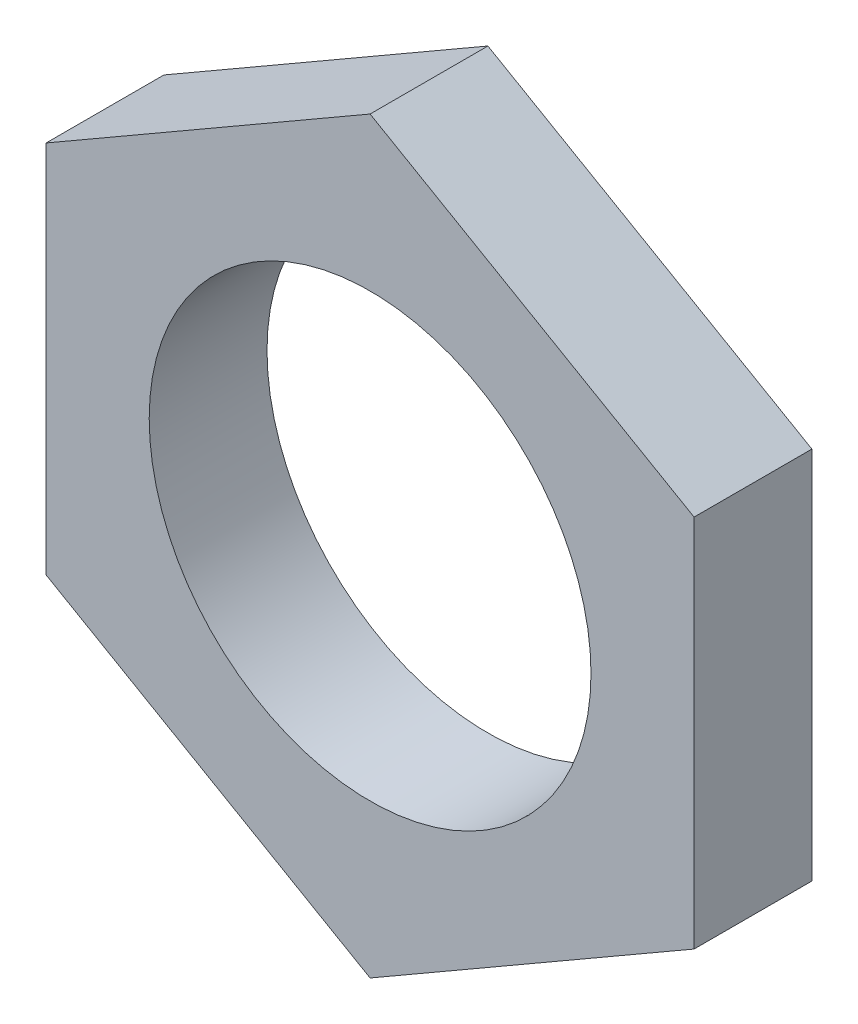
ISO-10303-21;
HEADER;
FILE_DESCRIPTION(('STEP AP214'),'2;1');
FILE_NAME('part.step','',(''),(''),'','','');
FILE_SCHEMA(('AUTOMOTIVE_DESIGN { 1 0 10303 214 1 1 1 1 }'));
ENDSEC;
DATA;
#1=APPLICATION_CONTEXT('core data for automotive mechanical design processes');
#2=APPLICATION_PROTOCOL_DEFINITION('international standard','automotive_design',2000,#1);
#3=PRODUCT_CONTEXT('',#1,'mechanical');
#4=PRODUCT('Part','Part','',(#3));
#5=PRODUCT_RELATED_PRODUCT_CATEGORY('part','',(#4));
#6=PRODUCT_DEFINITION_FORMATION('','',#4);
#7=PRODUCT_DEFINITION_CONTEXT('part definition',#1,'design');
#8=PRODUCT_DEFINITION('design','',#6,#7);
#9=PRODUCT_DEFINITION_SHAPE('','',#8);
#10=(LENGTH_UNIT() NAMED_UNIT(*) SI_UNIT(.MILLI.,.METRE.));
#11=(NAMED_UNIT(*) PLANE_ANGLE_UNIT() SI_UNIT($,.RADIAN.));
#12=(NAMED_UNIT(*) SI_UNIT($,.STERADIAN.) SOLID_ANGLE_UNIT());
#13=UNCERTAINTY_MEASURE_WITH_UNIT(LENGTH_MEASURE(1.E-05),#10,'distance_accuracy_value','');
#14=(GEOMETRIC_REPRESENTATION_CONTEXT(3) GLOBAL_UNCERTAINTY_ASSIGNED_CONTEXT((#13)) GLOBAL_UNIT_ASSIGNED_CONTEXT((#10,
#11,#12)) REPRESENTATION_CONTEXT('',''));
#15=CARTESIAN_POINT('',(0.,0.,0.));
#16=DIRECTION('',(0.,0.,1.));
#17=DIRECTION('',(1.,0.,0.));
#18=AXIS2_PLACEMENT_3D('',#15,#16,#17);
#19=CARTESIAN_POINT('',(0.,0.,2.));
#20=DIRECTION('',(0.,0.,1.));
#21=DIRECTION('',(1.,0.,0.));
#22=AXIS2_PLACEMENT_3D('',#19,#20,#21);
#23=PLANE('',#22);
#24=DIRECTION('',(-0.866025403784442,0.5,0.));
#25=VECTOR('',#24,1.);
#26=CARTESIAN_POINT('',(5.5,3.175426480543,2.));
#27=LINE('',#26,#25);
#28=CARTESIAN_POINT('',(5.5,3.175426480543,2.));
#29=VERTEX_POINT('',#28);
#30=CARTESIAN_POINT('',(0.,6.35085296108587,2.));
#31=VERTEX_POINT('',#30);
#32=EDGE_CURVE('E114',#29,#31,#27,.T.);
#33=ORIENTED_EDGE('',*,*,#32,.T.);
#34=DIRECTION('',(-0.866025403784438,-0.5,0.));
#35=VECTOR('',#34,1.);
#36=CARTESIAN_POINT('',(0.,6.35085296108587,2.));
#37=LINE('',#36,#35);
#38=CARTESIAN_POINT('',(-5.5,3.17542648054293,2.));
#39=VERTEX_POINT('',#38);
#40=EDGE_CURVE('E75',#31,#39,#37,.T.);
#41=ORIENTED_EDGE('',*,*,#40,.T.);
#42=DIRECTION('',(0.,-1.,0.));
#43=VECTOR('',#42,1.);
#44=CARTESIAN_POINT('',(-5.5,3.17542648054293,2.));
#45=LINE('',#44,#43);
#46=CARTESIAN_POINT('',(-5.5,-3.17542648054297,2.));
#47=VERTEX_POINT('',#46);
#48=EDGE_CURVE('E82',#39,#47,#45,.T.);
#49=ORIENTED_EDGE('',*,*,#48,.T.);
#50=DIRECTION('',(0.866025403784442,-0.5,0.));
#51=VECTOR('',#50,1.);
#52=CARTESIAN_POINT('',(-5.5,-3.17542648054297,2.));
#53=LINE('',#52,#51);
#54=CARTESIAN_POINT('',(0.,-6.35085296108587,2.));
#55=VERTEX_POINT('',#54);
#56=EDGE_CURVE('E77',#47,#55,#53,.T.);
#57=ORIENTED_EDGE('',*,*,#56,.T.);
#58=DIRECTION('',(0.866025403784435,0.500000000000007,0.));
#59=VECTOR('',#58,1.);
#60=CARTESIAN_POINT('',(0.,-6.35085296108587,2.));
#61=LINE('',#60,#59);
#62=CARTESIAN_POINT('',(5.5,-3.17542648054289,2.));
#63=VERTEX_POINT('',#62);
#64=EDGE_CURVE('E85',#55,#63,#61,.T.);
#65=ORIENTED_EDGE('',*,*,#64,.T.);
#66=DIRECTION('',(0.,1.,0.));
#67=VECTOR('',#66,1.);
#68=CARTESIAN_POINT('',(5.5,-3.17542648054289,2.));
#69=LINE('',#68,#67);
#70=EDGE_CURVE('E35',#63,#29,#69,.T.);
#71=ORIENTED_EDGE('',*,*,#70,.T.);
#72=EDGE_LOOP('',(#33,#41,#49,#57,#65,#71));
#73=FACE_BOUND('',#72,.T.);
#74=CARTESIAN_POINT('',(0.,0.,2.));
#75=DIRECTION('',(0.,0.,1.));
#76=DIRECTION('',(1.,0.,0.));
#77=AXIS2_PLACEMENT_3D('',#74,#75,#76);
#78=CIRCLE('',#77,3.75);
#79=CARTESIAN_POINT('',(3.75,0.,2.));
#80=VERTEX_POINT('',#79);
#81=EDGE_CURVE('E106',#80,#80,#78,.T.);
#82=ORIENTED_EDGE('',*,*,#81,.F.);
#83=EDGE_LOOP('',(#82));
#84=FACE_BOUND('',#83,.T.);
#85=ADVANCED_FACE('F17',(#73,#84),#23,.T.);
#86=CARTESIAN_POINT('',(0.,0.,0.));
#87=DIRECTION('',(0.,0.,1.));
#88=DIRECTION('',(1.,0.,0.));
#89=AXIS2_PLACEMENT_3D('',#86,#87,#88);
#90=PLANE('',#89);
#91=DIRECTION('',(-0.866025403784442,0.5,0.));
#92=VECTOR('',#91,1.);
#93=CARTESIAN_POINT('',(5.5,3.175426480543,0.));
#94=LINE('',#93,#92);
#95=CARTESIAN_POINT('',(5.5,3.175426480543,0.));
#96=VERTEX_POINT('',#95);
#97=CARTESIAN_POINT('',(0.,6.35085296108587,0.));
#98=VERTEX_POINT('',#97);
#99=EDGE_CURVE('E105',#96,#98,#94,.T.);
#100=ORIENTED_EDGE('',*,*,#99,.F.);
#101=DIRECTION('',(0.,1.,0.));
#102=VECTOR('',#101,1.);
#103=CARTESIAN_POINT('',(5.5,-3.17542648054289,0.));
#104=LINE('',#103,#102);
#105=CARTESIAN_POINT('',(5.5,-3.17542648054289,0.));
#106=VERTEX_POINT('',#105);
#107=EDGE_CURVE('E64',#106,#96,#104,.T.);
#108=ORIENTED_EDGE('',*,*,#107,.F.);
#109=DIRECTION('',(0.866025403784435,0.500000000000007,0.));
#110=VECTOR('',#109,1.);
#111=CARTESIAN_POINT('',(0.,-6.35085296108587,0.));
#112=LINE('',#111,#110);
#113=CARTESIAN_POINT('',(0.,-6.35085296108587,0.));
#114=VERTEX_POINT('',#113);
#115=EDGE_CURVE('E60',#114,#106,#112,.T.);
#116=ORIENTED_EDGE('',*,*,#115,.F.);
#117=DIRECTION('',(0.866025403784442,-0.5,0.));
#118=VECTOR('',#117,1.);
#119=CARTESIAN_POINT('',(-5.5,-3.17542648054297,0.));
#120=LINE('',#119,#118);
#121=CARTESIAN_POINT('',(-5.5,-3.17542648054297,0.));
#122=VERTEX_POINT('',#121);
#123=EDGE_CURVE('E95',#122,#114,#120,.T.);
#124=ORIENTED_EDGE('',*,*,#123,.F.);
#125=DIRECTION('',(0.,-1.,0.));
#126=VECTOR('',#125,1.);
#127=CARTESIAN_POINT('',(-5.5,3.17542648054293,0.));
#128=LINE('',#127,#126);
#129=CARTESIAN_POINT('',(-5.5,3.17542648054293,0.));
#130=VERTEX_POINT('',#129);
#131=EDGE_CURVE('E107',#130,#122,#128,.T.);
#132=ORIENTED_EDGE('',*,*,#131,.F.);
#133=DIRECTION('',(-0.866025403784438,-0.5,0.));
#134=VECTOR('',#133,1.);
#135=CARTESIAN_POINT('',(0.,6.35085296108587,0.));
#136=LINE('',#135,#134);
#137=EDGE_CURVE('E104',#98,#130,#136,.T.);
#138=ORIENTED_EDGE('',*,*,#137,.F.);
#139=EDGE_LOOP('',(#100,#108,#116,#124,#132,#138));
#140=FACE_BOUND('',#139,.T.);
#141=CARTESIAN_POINT('',(0.,0.,0.));
#142=DIRECTION('',(0.,0.,1.));
#143=DIRECTION('',(1.,0.,0.));
#144=AXIS2_PLACEMENT_3D('',#141,#142,#143);
#145=CIRCLE('',#144,3.75);
#146=CARTESIAN_POINT('',(3.75,0.,0.));
#147=VERTEX_POINT('',#146);
#148=EDGE_CURVE('E192',#147,#147,#145,.T.);
#149=ORIENTED_EDGE('',*,*,#148,.T.);
#150=EDGE_LOOP('',(#149));
#151=FACE_BOUND('',#150,.T.);
#152=ADVANCED_FACE('F125',(#140,#151),#90,.F.);
#153=CARTESIAN_POINT('',(5.5,3.175426480543,2.));
#154=DIRECTION('',(-0.5,-0.866025403784442,0.));
#155=DIRECTION('',(0.866025403784442,-0.5,0.));
#156=AXIS2_PLACEMENT_3D('',#153,#154,#155);
#157=PLANE('',#156);
#158=ORIENTED_EDGE('',*,*,#99,.T.);
#159=DIRECTION('',(0.,0.,-1.));
#160=VECTOR('',#159,1.);
#161=CARTESIAN_POINT('',(0.,6.35085296108587,2.));
#162=LINE('',#161,#160);
#163=EDGE_CURVE('E11',#31,#98,#162,.T.);
#164=ORIENTED_EDGE('',*,*,#163,.F.);
#165=ORIENTED_EDGE('',*,*,#32,.F.);
#166=DIRECTION('',(0.,0.,-1.));
#167=VECTOR('',#166,1.);
#168=CARTESIAN_POINT('',(5.5,3.175426480543,2.));
#169=LINE('',#168,#167);
#170=EDGE_CURVE('E98',#29,#96,#169,.T.);
#171=ORIENTED_EDGE('',*,*,#170,.T.);
#172=EDGE_LOOP('',(#158,#164,#165,#171));
#173=FACE_BOUND('',#172,.T.);
#174=ADVANCED_FACE('F19',(#173),#157,.F.);
#175=CARTESIAN_POINT('',(0.,6.35085296108587,2.));
#176=DIRECTION('',(0.5,-0.866025403784438,0.));
#177=DIRECTION('',(0.866025403784438,0.5,0.));
#178=AXIS2_PLACEMENT_3D('',#175,#176,#177);
#179=PLANE('',#178);
#180=ORIENTED_EDGE('',*,*,#137,.T.);
#181=DIRECTION('',(0.,0.,-1.));
#182=VECTOR('',#181,1.);
#183=CARTESIAN_POINT('',(-5.5,3.17542648054293,2.));
#184=LINE('',#183,#182);
#185=EDGE_CURVE('E27',#39,#130,#184,.T.);
#186=ORIENTED_EDGE('',*,*,#185,.F.);
#187=ORIENTED_EDGE('',*,*,#40,.F.);
#188=ORIENTED_EDGE('',*,*,#163,.T.);
#189=EDGE_LOOP('',(#180,#186,#187,#188));
#190=FACE_BOUND('',#189,.T.);
#191=ADVANCED_FACE('F151',(#190),#179,.F.);
#192=CARTESIAN_POINT('',(-5.5,3.17542648054293,2.));
#193=DIRECTION('',(1.,0.,0.));
#194=DIRECTION('',(0.,1.,0.));
#195=AXIS2_PLACEMENT_3D('',#192,#193,#194);
#196=PLANE('',#195);
#197=ORIENTED_EDGE('',*,*,#131,.T.);
#198=DIRECTION('',(0.,0.,-1.));
#199=VECTOR('',#198,1.);
#200=CARTESIAN_POINT('',(-5.5,-3.17542648054297,2.));
#201=LINE('',#200,#199);
#202=EDGE_CURVE('E91',#47,#122,#201,.T.);
#203=ORIENTED_EDGE('',*,*,#202,.F.);
#204=ORIENTED_EDGE('',*,*,#48,.F.);
#205=ORIENTED_EDGE('',*,*,#185,.T.);
#206=EDGE_LOOP('',(#197,#203,#204,#205));
#207=FACE_BOUND('',#206,.T.);
#208=ADVANCED_FACE('F118',(#207),#196,.F.);
#209=CARTESIAN_POINT('',(-5.5,-3.17542648054297,2.));
#210=DIRECTION('',(0.5,0.866025403784442,0.));
#211=DIRECTION('',(-0.866025403784442,0.5,0.));
#212=AXIS2_PLACEMENT_3D('',#209,#210,#211);
#213=PLANE('',#212);
#214=ORIENTED_EDGE('',*,*,#123,.T.);
#215=DIRECTION('',(0.,0.,-1.));
#216=VECTOR('',#215,1.);
#217=CARTESIAN_POINT('',(0.,-6.35085296108587,2.));
#218=LINE('',#217,#216);
#219=EDGE_CURVE('E90',#55,#114,#218,.T.);
#220=ORIENTED_EDGE('',*,*,#219,.F.);
#221=ORIENTED_EDGE('',*,*,#56,.F.);
#222=ORIENTED_EDGE('',*,*,#202,.T.);
#223=EDGE_LOOP('',(#214,#220,#221,#222));
#224=FACE_BOUND('',#223,.T.);
#225=ADVANCED_FACE('F89',(#224),#213,.F.);
#226=CARTESIAN_POINT('',(0.,-6.35085296108587,2.));
#227=DIRECTION('',(-0.500000000000007,0.866025403784435,0.));
#228=DIRECTION('',(-0.866025403784435,-0.500000000000007,0.));
#229=AXIS2_PLACEMENT_3D('',#226,#227,#228);
#230=PLANE('',#229);
#231=ORIENTED_EDGE('',*,*,#115,.T.);
#232=DIRECTION('',(0.,0.,-1.));
#233=VECTOR('',#232,1.);
#234=CARTESIAN_POINT('',(5.5,-3.17542648054289,2.));
#235=LINE('',#234,#233);
#236=EDGE_CURVE('E94',#63,#106,#235,.T.);
#237=ORIENTED_EDGE('',*,*,#236,.F.);
#238=ORIENTED_EDGE('',*,*,#64,.F.);
#239=ORIENTED_EDGE('',*,*,#219,.T.);
#240=EDGE_LOOP('',(#231,#237,#238,#239));
#241=FACE_BOUND('',#240,.T.);
#242=ADVANCED_FACE('F96',(#241),#230,.F.);
#243=CARTESIAN_POINT('',(5.5,-3.17542648054289,2.));
#244=DIRECTION('',(-1.,0.,0.));
#245=DIRECTION('',(0.,-1.,0.));
#246=AXIS2_PLACEMENT_3D('',#243,#244,#245);
#247=PLANE('',#246);
#248=ORIENTED_EDGE('',*,*,#107,.T.);
#249=ORIENTED_EDGE('',*,*,#170,.F.);
#250=ORIENTED_EDGE('',*,*,#70,.F.);
#251=ORIENTED_EDGE('',*,*,#236,.T.);
#252=EDGE_LOOP('',(#248,#249,#250,#251));
#253=FACE_BOUND('',#252,.T.);
#254=ADVANCED_FACE('F126',(#253),#247,.F.);
#255=CARTESIAN_POINT('',(0.,0.,2.));
#256=DIRECTION('',(0.,0.,-1.));
#257=DIRECTION('',(-1.,0.,0.));
#258=AXIS2_PLACEMENT_3D('',#255,#256,#257);
#259=CYLINDRICAL_SURFACE('',#258,3.75);
#260=ORIENTED_EDGE('',*,*,#81,.T.);
#261=EDGE_LOOP('',(#260));
#262=FACE_BOUND('',#261,.T.);
#263=ORIENTED_EDGE('',*,*,#148,.F.);
#264=EDGE_LOOP('',(#263));
#265=FACE_BOUND('',#264,.T.);
#266=ADVANCED_FACE('F127',(#262,#265),#259,.F.);
#267=CLOSED_SHELL('',(#85,#152,#174,#191,#208,#225,#242,#254,#266));
#268=MANIFOLD_SOLID_BREP('B1',#267);
#269=ADVANCED_BREP_SHAPE_REPRESENTATION('',(#18,#268),#14);
#270=SHAPE_DEFINITION_REPRESENTATION(#9,#269);
ENDSEC;
END-ISO-10303-21;
